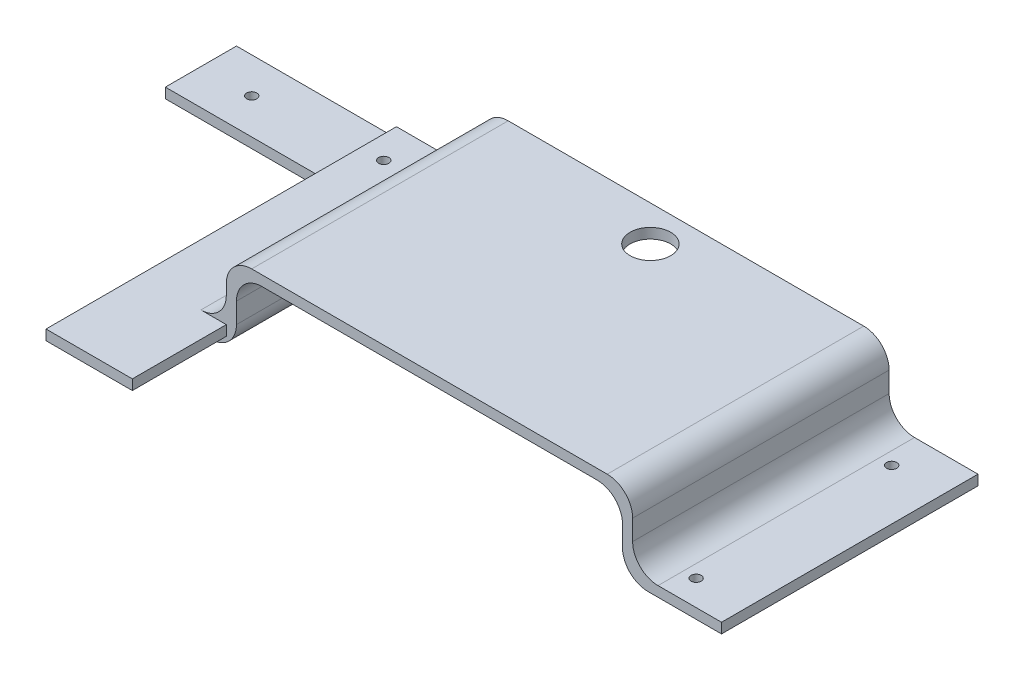
ISO-10303-21;
HEADER;
FILE_DESCRIPTION(('STEP AP214'),'2;1');
FILE_NAME('part.step','',(''),(''),'','','');
FILE_SCHEMA(('AUTOMOTIVE_DESIGN { 1 0 10303 214 1 1 1 1 }'));
ENDSEC;
DATA;
#1=APPLICATION_CONTEXT('core data for automotive mechanical design processes');
#2=APPLICATION_PROTOCOL_DEFINITION('international standard','automotive_design',2000,#1);
#3=PRODUCT_CONTEXT('',#1,'mechanical');
#4=PRODUCT('Part','Part','',(#3));
#5=PRODUCT_RELATED_PRODUCT_CATEGORY('part','',(#4));
#6=PRODUCT_DEFINITION_FORMATION('','',#4);
#7=PRODUCT_DEFINITION_CONTEXT('part definition',#1,'design');
#8=PRODUCT_DEFINITION('design','',#6,#7);
#9=PRODUCT_DEFINITION_SHAPE('','',#8);
#10=(LENGTH_UNIT() NAMED_UNIT(*) SI_UNIT(.MILLI.,.METRE.));
#11=(NAMED_UNIT(*) PLANE_ANGLE_UNIT() SI_UNIT($,.RADIAN.));
#12=(NAMED_UNIT(*) SI_UNIT($,.STERADIAN.) SOLID_ANGLE_UNIT());
#13=UNCERTAINTY_MEASURE_WITH_UNIT(LENGTH_MEASURE(1.E-05),#10,'distance_accuracy_value','');
#14=(GEOMETRIC_REPRESENTATION_CONTEXT(3) GLOBAL_UNCERTAINTY_ASSIGNED_CONTEXT((#13)) GLOBAL_UNIT_ASSIGNED_CONTEXT((#10,
#11,#12)) REPRESENTATION_CONTEXT('',''));
#15=CARTESIAN_POINT('',(0.,0.,0.));
#16=DIRECTION('',(0.,0.,1.));
#17=DIRECTION('',(1.,0.,0.));
#18=AXIS2_PLACEMENT_3D('',#15,#16,#17);
#19=CARTESIAN_POINT('',(0.,22.,-87.));
#20=DIRECTION('',(0.,1.,0.));
#21=DIRECTION('',(0.,0.,-1.));
#22=AXIS2_PLACEMENT_3D('',#19,#20,#21);
#23=PLANE('',#22);
#24=CARTESIAN_POINT('',(10.,22.,-87.));
#25=DIRECTION('',(0.,-1.,0.));
#26=DIRECTION('',(0.,0.,-1.));
#27=AXIS2_PLACEMENT_3D('',#24,#25,#26);
#28=CIRCLE('',#27,4.);
#29=CARTESIAN_POINT('',(10.,22.,-91.));
#30=VERTEX_POINT('',#29);
#31=EDGE_CURVE('E249',#30,#30,#28,.T.);
#32=ORIENTED_EDGE('',*,*,#31,.F.);
#33=EDGE_LOOP('',(#32));
#34=FACE_BOUND('',#33,.T.);
#35=DIRECTION('',(1.,0.,0.));
#36=VECTOR('',#35,1.);
#37=CARTESIAN_POINT('',(0.,22.,-43.5));
#38=LINE('',#37,#36);
#39=CARTESIAN_POINT('',(-23.,22.,-43.5));
#40=VERTEX_POINT('',#39);
#41=CARTESIAN_POINT('',(43.,22.,-43.5));
#42=VERTEX_POINT('',#41);
#43=EDGE_CURVE('E377',#40,#42,#38,.T.);
#44=ORIENTED_EDGE('',*,*,#43,.F.);
#45=DIRECTION('',(0.,0.,-1.));
#46=VECTOR('',#45,1.);
#47=CARTESIAN_POINT('',(-23.,22.,-87.));
#48=LINE('',#47,#46);
#49=CARTESIAN_POINT('',(-23.,22.,-94.));
#50=VERTEX_POINT('',#49);
#51=EDGE_CURVE('E320',#50,#40,#48,.F.);
#52=ORIENTED_EDGE('',*,*,#51,.F.);
#53=DIRECTION('',(1.,0.,0.));
#54=VECTOR('',#53,1.);
#55=CARTESIAN_POINT('',(0.,22.,-94.));
#56=LINE('',#55,#54);
#57=CARTESIAN_POINT('',(43.,22.,-94.));
#58=VERTEX_POINT('',#57);
#59=EDGE_CURVE('E266',#50,#58,#56,.T.);
#60=ORIENTED_EDGE('',*,*,#59,.T.);
#61=DIRECTION('',(0.,0.,-1.));
#62=VECTOR('',#61,1.);
#63=CARTESIAN_POINT('',(43.,22.,-87.));
#64=LINE('',#63,#62);
#65=EDGE_CURVE('E323',#42,#58,#64,.T.);
#66=ORIENTED_EDGE('',*,*,#65,.F.);
#67=EDGE_LOOP('',(#44,#52,#60,#66));
#68=FACE_BOUND('',#67,.T.);
#69=ADVANCED_FACE('F45',(#34,#68),#23,.F.);
#70=CARTESIAN_POINT('',(0.,9.99999999999999,-29.8776496959689));
#71=DIRECTION('',(0.,1.,0.));
#72=DIRECTION('',(-1.,0.,0.));
#73=AXIS2_PLACEMENT_3D('',#70,#71,#72);
#74=PLANE('',#73);
#75=CARTESIAN_POINT('',(-68.5,9.99999999999999,-87.));
#76=DIRECTION('',(0.,-1.,0.));
#77=DIRECTION('',(-1.,0.,0.));
#78=AXIS2_PLACEMENT_3D('',#75,#76,#77);
#79=CIRCLE('',#78,0.999999999999998);
#80=CARTESIAN_POINT('',(-69.5,9.99999999999999,-87.));
#81=VERTEX_POINT('',#80);
#82=EDGE_CURVE('E430',#81,#81,#79,.F.);
#83=ORIENTED_EDGE('',*,*,#82,.F.);
#84=EDGE_LOOP('',(#83));
#85=FACE_BOUND('',#84,.T.);
#86=DIRECTION('',(-1.,0.,0.));
#87=VECTOR('',#86,1.);
#88=CARTESIAN_POINT('',(0.,9.99999999999999,-94.));
#89=LINE('',#88,#87);
#90=CARTESIAN_POINT('',(-47.,9.99999999999999,-94.));
#91=VERTEX_POINT('',#90);
#92=CARTESIAN_POINT('',(-78.5,9.99999999999999,-94.));
#93=VERTEX_POINT('',#92);
#94=EDGE_CURVE('E270',#91,#93,#89,.T.);
#95=ORIENTED_EDGE('',*,*,#94,.T.);
#96=DIRECTION('',(0.,0.,1.));
#97=VECTOR('',#96,1.);
#98=CARTESIAN_POINT('',(-78.5,9.99999999999999,-94.));
#99=LINE('',#98,#97);
#100=CARTESIAN_POINT('',(-78.5,9.99999999999999,-80.));
#101=VERTEX_POINT('',#100);
#102=EDGE_CURVE('E466',#93,#101,#99,.T.);
#103=ORIENTED_EDGE('',*,*,#102,.T.);
#104=DIRECTION('',(1.,0.,0.));
#105=VECTOR('',#104,1.);
#106=CARTESIAN_POINT('',(0.,9.99999999999999,-80.));
#107=LINE('',#106,#105);
#108=CARTESIAN_POINT('',(-47.,9.99999999999999,-80.));
#109=VERTEX_POINT('',#108);
#110=EDGE_CURVE('E259',#101,#109,#107,.T.);
#111=ORIENTED_EDGE('',*,*,#110,.T.);
#112=DIRECTION('',(0.,0.,1.));
#113=VECTOR('',#112,1.);
#114=CARTESIAN_POINT('',(-47.,9.99999999999999,-111.117242768624));
#115=LINE('',#114,#113);
#116=EDGE_CURVE('E453',#91,#109,#115,.T.);
#117=ORIENTED_EDGE('',*,*,#116,.F.);
#118=EDGE_LOOP('',(#95,#103,#111,#117));
#119=FACE_BOUND('',#118,.T.);
#120=ADVANCED_FACE('F476',(#85,#119),#74,.T.);
#121=CARTESIAN_POINT('',(-30.,0.,-29.8776496959689));
#122=DIRECTION('',(-1.,0.,0.));
#123=DIRECTION('',(0.,0.,-1.));
#124=AXIS2_PLACEMENT_3D('',#121,#122,#123);
#125=PLANE('',#124);
#126=DIRECTION('',(0.,-1.,0.));
#127=VECTOR('',#126,1.);
#128=CARTESIAN_POINT('',(-30.,0.,-94.));
#129=LINE('',#128,#127);
#130=CARTESIAN_POINT('',(-30.,19.,-94.));
#131=VERTEX_POINT('',#130);
#132=CARTESIAN_POINT('',(-30.,17.,-94.));
#133=VERTEX_POINT('',#132);
#134=EDGE_CURVE('E267',#131,#133,#129,.T.);
#135=ORIENTED_EDGE('',*,*,#134,.T.);
#136=DIRECTION('',(0.,0.,1.));
#137=VECTOR('',#136,1.);
#138=CARTESIAN_POINT('',(-30.,17.,-29.8776496959689));
#139=LINE('',#138,#137);
#140=CARTESIAN_POINT('',(-30.,17.,-43.5));
#141=VERTEX_POINT('',#140);
#142=EDGE_CURVE('E303',#141,#133,#139,.F.);
#143=ORIENTED_EDGE('',*,*,#142,.F.);
#144=DIRECTION('',(0.,-1.,0.));
#145=VECTOR('',#144,1.);
#146=CARTESIAN_POINT('',(-30.,0.,-43.5));
#147=LINE('',#146,#145);
#148=CARTESIAN_POINT('',(-30.,19.,-43.5));
#149=VERTEX_POINT('',#148);
#150=EDGE_CURVE('E371',#149,#141,#147,.T.);
#151=ORIENTED_EDGE('',*,*,#150,.F.);
#152=DIRECTION('',(0.,0.,-1.));
#153=VECTOR('',#152,1.);
#154=CARTESIAN_POINT('',(-30.,19.,-29.8776496959689));
#155=LINE('',#154,#153);
#156=EDGE_CURVE('E306',#131,#149,#155,.F.);
#157=ORIENTED_EDGE('',*,*,#156,.F.);
#158=EDGE_LOOP('',(#135,#143,#151,#157));
#159=FACE_BOUND('',#158,.T.);
#160=ADVANCED_FACE('F531',(#159),#125,.T.);
#161=CARTESIAN_POINT('',(0.,24.,-87.));
#162=DIRECTION('',(0.,1.,0.));
#163=DIRECTION('',(0.,0.,-1.));
#164=AXIS2_PLACEMENT_3D('',#161,#162,#163);
#165=PLANE('',#164);
#166=CARTESIAN_POINT('',(10.,24.,-87.));
#167=DIRECTION('',(0.,-1.,0.));
#168=DIRECTION('',(0.,0.,-1.));
#169=AXIS2_PLACEMENT_3D('',#166,#167,#168);
#170=CIRCLE('',#169,4.);
#171=CARTESIAN_POINT('',(10.,24.,-91.));
#172=VERTEX_POINT('',#171);
#173=EDGE_CURVE('E243',#172,#172,#170,.F.);
#174=ORIENTED_EDGE('',*,*,#173,.F.);
#175=EDGE_LOOP('',(#174));
#176=FACE_BOUND('',#175,.T.);
#177=DIRECTION('',(1.,0.,0.));
#178=VECTOR('',#177,1.);
#179=CARTESIAN_POINT('',(0.,24.,-43.5));
#180=LINE('',#179,#178);
#181=CARTESIAN_POINT('',(-25.,24.,-43.5));
#182=VERTEX_POINT('',#181);
#183=CARTESIAN_POINT('',(45.,24.,-43.5));
#184=VERTEX_POINT('',#183);
#185=EDGE_CURVE('E368',#182,#184,#180,.T.);
#186=ORIENTED_EDGE('',*,*,#185,.T.);
#187=DIRECTION('',(0.,0.,-1.));
#188=VECTOR('',#187,1.);
#189=CARTESIAN_POINT('',(45.,24.,-87.));
#190=LINE('',#189,#188);
#191=CARTESIAN_POINT('',(45.,24.,-94.));
#192=VERTEX_POINT('',#191);
#193=EDGE_CURVE('E280',#192,#184,#190,.F.);
#194=ORIENTED_EDGE('',*,*,#193,.F.);
#195=DIRECTION('',(1.,0.,0.));
#196=VECTOR('',#195,1.);
#197=CARTESIAN_POINT('',(0.,24.,-94.));
#198=LINE('',#197,#196);
#199=CARTESIAN_POINT('',(-25.,24.,-94.));
#200=VERTEX_POINT('',#199);
#201=EDGE_CURVE('E278',#200,#192,#198,.T.);
#202=ORIENTED_EDGE('',*,*,#201,.F.);
#203=DIRECTION('',(0.,0.,-1.));
#204=VECTOR('',#203,1.);
#205=CARTESIAN_POINT('',(-25.,24.,-87.));
#206=LINE('',#205,#204);
#207=EDGE_CURVE('E290',#182,#200,#206,.T.);
#208=ORIENTED_EDGE('',*,*,#207,.F.);
#209=EDGE_LOOP('',(#186,#194,#202,#208));
#210=FACE_BOUND('',#209,.T.);
#211=ADVANCED_FACE('F524',(#176,#210),#165,.T.);
#212=CARTESIAN_POINT('',(0.,24.,-94.));
#213=DIRECTION('',(0.,0.,1.));
#214=DIRECTION('',(-1.,0.,0.));
#215=AXIS2_PLACEMENT_3D('',#212,#213,#214);
#216=PLANE('',#215);
#217=ORIENTED_EDGE('',*,*,#201,.T.);
#218=CARTESIAN_POINT('',(45.,19.,-94.));
#219=DIRECTION('',(0.,0.,-1.));
#220=DIRECTION('',(-1.,0.,0.));
#221=AXIS2_PLACEMENT_3D('',#218,#219,#220);
#222=CIRCLE('',#221,5.);
#223=CARTESIAN_POINT('',(50.,19.,-94.));
#224=VERTEX_POINT('',#223);
#225=EDGE_CURVE('E299',#224,#192,#222,.F.);
#226=ORIENTED_EDGE('',*,*,#225,.F.);
#227=DIRECTION('',(0.,1.,0.));
#228=VECTOR('',#227,1.);
#229=CARTESIAN_POINT('',(50.,0.,-94.));
#230=LINE('',#229,#228);
#231=CARTESIAN_POINT('',(50.,15.,-94.));
#232=VERTEX_POINT('',#231);
#233=EDGE_CURVE('E242',#232,#224,#230,.T.);
#234=ORIENTED_EDGE('',*,*,#233,.F.);
#235=CARTESIAN_POINT('',(55.,15.,-94.));
#236=DIRECTION('',(0.,0.,-1.));
#237=DIRECTION('',(-1.,0.,0.));
#238=AXIS2_PLACEMENT_3D('',#235,#236,#237);
#239=CIRCLE('',#238,5.);
#240=CARTESIAN_POINT('',(55.,10.,-94.));
#241=VERTEX_POINT('',#240);
#242=EDGE_CURVE('E53',#241,#232,#239,.T.);
#243=ORIENTED_EDGE('',*,*,#242,.F.);
#244=DIRECTION('',(-1.,0.,0.));
#245=VECTOR('',#244,1.);
#246=CARTESIAN_POINT('',(0.,9.99999999999999,-94.));
#247=LINE('',#246,#245);
#248=CARTESIAN_POINT('',(67.5,10.,-94.));
#249=VERTEX_POINT('',#248);
#250=EDGE_CURVE('E223',#249,#241,#247,.T.);
#251=ORIENTED_EDGE('',*,*,#250,.F.);
#252=DIRECTION('',(0.,-1.,0.));
#253=VECTOR('',#252,1.);
#254=CARTESIAN_POINT('',(67.5,10.,-94.));
#255=LINE('',#254,#253);
#256=CARTESIAN_POINT('',(67.5,8.,-94.));
#257=VERTEX_POINT('',#256);
#258=EDGE_CURVE('E228',#249,#257,#255,.T.);
#259=ORIENTED_EDGE('',*,*,#258,.T.);
#260=DIRECTION('',(1.,0.,0.));
#261=VECTOR('',#260,1.);
#262=CARTESIAN_POINT('',(0.,8.,-94.));
#263=LINE('',#262,#261);
#264=CARTESIAN_POINT('',(53.,8.,-94.));
#265=VERTEX_POINT('',#264);
#266=EDGE_CURVE('E257',#265,#257,#263,.T.);
#267=ORIENTED_EDGE('',*,*,#266,.F.);
#268=CARTESIAN_POINT('',(53.,13.,-94.));
#269=DIRECTION('',(0.,0.,-1.));
#270=DIRECTION('',(-1.,0.,0.));
#271=AXIS2_PLACEMENT_3D('',#268,#269,#270);
#272=CIRCLE('',#271,5.);
#273=CARTESIAN_POINT('',(48.,13.,-94.));
#274=VERTEX_POINT('',#273);
#275=EDGE_CURVE('E293',#274,#265,#272,.F.);
#276=ORIENTED_EDGE('',*,*,#275,.F.);
#277=DIRECTION('',(0.,-1.,0.));
#278=VECTOR('',#277,1.);
#279=CARTESIAN_POINT('',(48.,0.,-94.));
#280=LINE('',#279,#278);
#281=CARTESIAN_POINT('',(48.,17.,-94.));
#282=VERTEX_POINT('',#281);
#283=EDGE_CURVE('E246',#282,#274,#280,.T.);
#284=ORIENTED_EDGE('',*,*,#283,.F.);
#285=CARTESIAN_POINT('',(43.,17.,-94.));
#286=DIRECTION('',(0.,0.,-1.));
#287=DIRECTION('',(-1.,0.,0.));
#288=AXIS2_PLACEMENT_3D('',#285,#286,#287);
#289=CIRCLE('',#288,5.);
#290=EDGE_CURVE('E351',#58,#282,#289,.T.);
#291=ORIENTED_EDGE('',*,*,#290,.F.);
#292=ORIENTED_EDGE('',*,*,#59,.F.);
#293=CARTESIAN_POINT('',(-23.,17.,-94.));
#294=DIRECTION('',(0.,0.,-1.));
#295=DIRECTION('',(-1.,0.,0.));
#296=AXIS2_PLACEMENT_3D('',#293,#294,#295);
#297=CIRCLE('',#296,5.);
#298=CARTESIAN_POINT('',(-28.,17.,-94.));
#299=VERTEX_POINT('',#298);
#300=EDGE_CURVE('E356',#299,#50,#297,.T.);
#301=ORIENTED_EDGE('',*,*,#300,.F.);
#302=DIRECTION('',(0.,1.,0.));
#303=VECTOR('',#302,1.);
#304=CARTESIAN_POINT('',(-28.,0.,-94.));
#305=LINE('',#304,#303);
#306=CARTESIAN_POINT('',(-28.,13.,-94.));
#307=VERTEX_POINT('',#306);
#308=EDGE_CURVE('E263',#307,#299,#305,.T.);
#309=ORIENTED_EDGE('',*,*,#308,.F.);
#310=CARTESIAN_POINT('',(-33.,13.,-94.));
#311=DIRECTION('',(0.,0.,-1.));
#312=DIRECTION('',(-1.,0.,0.));
#313=AXIS2_PLACEMENT_3D('',#310,#311,#312);
#314=CIRCLE('',#313,5.);
#315=CARTESIAN_POINT('',(-33.,8.,-94.));
#316=VERTEX_POINT('',#315);
#317=EDGE_CURVE('E296',#316,#307,#314,.F.);
#318=ORIENTED_EDGE('',*,*,#317,.F.);
#319=DIRECTION('',(1.,0.,0.));
#320=VECTOR('',#319,1.);
#321=CARTESIAN_POINT('',(0.,8.,-94.));
#322=LINE('',#321,#320);
#323=CARTESIAN_POINT('',(-78.5,8.,-94.));
#324=VERTEX_POINT('',#323);
#325=EDGE_CURVE('E273',#324,#316,#322,.T.);
#326=ORIENTED_EDGE('',*,*,#325,.F.);
#327=DIRECTION('',(0.,1.,0.));
#328=VECTOR('',#327,1.);
#329=CARTESIAN_POINT('',(-78.5,8.,-94.));
#330=LINE('',#329,#328);
#331=EDGE_CURVE('E464',#324,#93,#330,.T.);
#332=ORIENTED_EDGE('',*,*,#331,.T.);
#333=ORIENTED_EDGE('',*,*,#94,.F.);
#334=DIRECTION('',(0.,1.,0.));
#335=VECTOR('',#334,1.);
#336=CARTESIAN_POINT('',(-47.,0.,-94.));
#337=LINE('',#336,#335);
#338=CARTESIAN_POINT('',(-47.,12.,-94.));
#339=VERTEX_POINT('',#338);
#340=EDGE_CURVE('E448',#91,#339,#337,.T.);
#341=ORIENTED_EDGE('',*,*,#340,.T.);
#342=DIRECTION('',(1.,0.,0.));
#343=VECTOR('',#342,1.);
#344=CARTESIAN_POINT('',(0.,12.,-94.));
#345=LINE('',#344,#343);
#346=CARTESIAN_POINT('',(-35.,12.,-94.));
#347=VERTEX_POINT('',#346);
#348=EDGE_CURVE('E452',#339,#347,#345,.T.);
#349=ORIENTED_EDGE('',*,*,#348,.T.);
#350=CARTESIAN_POINT('',(-35.,17.,-94.));
#351=DIRECTION('',(0.,0.,-1.));
#352=DIRECTION('',(-1.,0.,0.));
#353=AXIS2_PLACEMENT_3D('',#350,#351,#352);
#354=CIRCLE('',#353,5.);
#355=EDGE_CURVE('E349',#133,#347,#354,.T.);
#356=ORIENTED_EDGE('',*,*,#355,.F.);
#357=ORIENTED_EDGE('',*,*,#134,.F.);
#358=CARTESIAN_POINT('',(-25.,19.,-94.));
#359=DIRECTION('',(0.,0.,-1.));
#360=DIRECTION('',(-1.,0.,0.));
#361=AXIS2_PLACEMENT_3D('',#358,#359,#360);
#362=CIRCLE('',#361,5.);
#363=EDGE_CURVE('E301',#200,#131,#362,.F.);
#364=ORIENTED_EDGE('',*,*,#363,.F.);
#365=EDGE_LOOP('',(#217,#226,#234,#243,#251,#259,#267,#276,#284,#291,#292,#301,#309,#318,#326,
#332,#333,#341,#349,#356,#357,#364));
#366=FACE_BOUND('',#365,.T.);
#367=ADVANCED_FACE('F239',(#366),#216,.F.);
#368=CARTESIAN_POINT('',(0.,24.,-80.));
#369=DIRECTION('',(0.,0.,-1.));
#370=DIRECTION('',(1.,0.,0.));
#371=AXIS2_PLACEMENT_3D('',#368,#369,#370);
#372=PLANE('',#371);
#373=ORIENTED_EDGE('',*,*,#110,.F.);
#374=DIRECTION('',(0.,-1.,0.));
#375=VECTOR('',#374,1.);
#376=CARTESIAN_POINT('',(-78.5,9.99999999999999,-80.));
#377=LINE('',#376,#375);
#378=CARTESIAN_POINT('',(-78.5,8.,-80.));
#379=VERTEX_POINT('',#378);
#380=EDGE_CURVE('E451',#101,#379,#377,.T.);
#381=ORIENTED_EDGE('',*,*,#380,.T.);
#382=DIRECTION('',(-1.,0.,0.));
#383=VECTOR('',#382,1.);
#384=CARTESIAN_POINT('',(0.,8.,-80.));
#385=LINE('',#384,#383);
#386=CARTESIAN_POINT('',(-47.,8.,-80.));
#387=VERTEX_POINT('',#386);
#388=EDGE_CURVE('E262',#387,#379,#385,.T.);
#389=ORIENTED_EDGE('',*,*,#388,.F.);
#390=DIRECTION('',(0.,-1.,0.));
#391=VECTOR('',#390,1.);
#392=CARTESIAN_POINT('',(-47.,0.,-80.));
#393=LINE('',#392,#391);
#394=EDGE_CURVE('E433',#109,#387,#393,.T.);
#395=ORIENTED_EDGE('',*,*,#394,.F.);
#396=EDGE_LOOP('',(#373,#381,#389,#395));
#397=FACE_BOUND('',#396,.T.);
#398=ADVANCED_FACE('F523',(#397),#372,.F.);
#399=CARTESIAN_POINT('',(-28.,0.,-29.8776496959689));
#400=DIRECTION('',(1.,0.,0.));
#401=DIRECTION('',(0.,1.,0.));
#402=AXIS2_PLACEMENT_3D('',#399,#400,#401);
#403=PLANE('',#402);
#404=DIRECTION('',(0.,1.,0.));
#405=VECTOR('',#404,1.);
#406=CARTESIAN_POINT('',(-28.,0.,-43.5));
#407=LINE('',#406,#405);
#408=CARTESIAN_POINT('',(-28.,13.,-43.5));
#409=VERTEX_POINT('',#408);
#410=CARTESIAN_POINT('',(-28.,17.,-43.5));
#411=VERTEX_POINT('',#410);
#412=EDGE_CURVE('E441',#409,#411,#407,.T.);
#413=ORIENTED_EDGE('',*,*,#412,.F.);
#414=DIRECTION('',(0.,0.,-1.));
#415=VECTOR('',#414,1.);
#416=CARTESIAN_POINT('',(-28.,13.,-29.8776496959689));
#417=LINE('',#416,#415);
#418=EDGE_CURVE('E331',#307,#409,#417,.F.);
#419=ORIENTED_EDGE('',*,*,#418,.F.);
#420=ORIENTED_EDGE('',*,*,#308,.T.);
#421=DIRECTION('',(0.,0.,-1.));
#422=VECTOR('',#421,1.);
#423=CARTESIAN_POINT('',(-28.,17.,-29.8776496959689));
#424=LINE('',#423,#422);
#425=EDGE_CURVE('E333',#411,#299,#424,.T.);
#426=ORIENTED_EDGE('',*,*,#425,.F.);
#427=EDGE_LOOP('',(#413,#419,#420,#426));
#428=FACE_BOUND('',#427,.T.);
#429=ADVANCED_FACE('F526',(#428),#403,.T.);
#430=CARTESIAN_POINT('',(0.,8.,-29.8776496959689));
#431=DIRECTION('',(0.,-1.,0.));
#432=DIRECTION('',(0.,0.,1.));
#433=AXIS2_PLACEMENT_3D('',#430,#431,#432);
#434=PLANE('',#433);
#435=CARTESIAN_POINT('',(-68.5,8.,-87.));
#436=DIRECTION('',(0.,-1.,0.));
#437=DIRECTION('',(0.,0.,-1.));
#438=AXIS2_PLACEMENT_3D('',#435,#436,#437);
#439=CIRCLE('',#438,0.999999999999998);
#440=CARTESIAN_POINT('',(-68.5,8.,-88.));
#441=VERTEX_POINT('',#440);
#442=EDGE_CURVE('E414',#441,#441,#439,.T.);
#443=ORIENTED_EDGE('',*,*,#442,.F.);
#444=EDGE_LOOP('',(#443));
#445=FACE_BOUND('',#444,.T.);
#446=CARTESIAN_POINT('',(-42.5,8.,-87.));
#447=DIRECTION('',(0.,-1.,0.));
#448=DIRECTION('',(0.,0.,-1.));
#449=AXIS2_PLACEMENT_3D('',#446,#447,#448);
#450=CIRCLE('',#449,0.999999999999998);
#451=CARTESIAN_POINT('',(-42.5,8.,-88.));
#452=VERTEX_POINT('',#451);
#453=EDGE_CURVE('E287',#452,#452,#450,.T.);
#454=ORIENTED_EDGE('',*,*,#453,.F.);
#455=EDGE_LOOP('',(#454));
#456=FACE_BOUND('',#455,.T.);
#457=DIRECTION('',(1.,0.,0.));
#458=VECTOR('',#457,1.);
#459=CARTESIAN_POINT('',(0.,8.,-43.5));
#460=LINE('',#459,#458);
#461=CARTESIAN_POINT('',(-47.,8.,-43.5));
#462=VERTEX_POINT('',#461);
#463=CARTESIAN_POINT('',(-33.,8.,-43.5));
#464=VERTEX_POINT('',#463);
#465=EDGE_CURVE('E437',#462,#464,#460,.T.);
#466=ORIENTED_EDGE('',*,*,#465,.F.);
#467=DIRECTION('',(0.,0.,-1.));
#468=VECTOR('',#467,1.);
#469=CARTESIAN_POINT('',(-47.,8.,-19.8991525575881));
#470=LINE('',#469,#468);
#471=EDGE_CURVE('E438',#462,#387,#470,.T.);
#472=ORIENTED_EDGE('',*,*,#471,.T.);
#473=ORIENTED_EDGE('',*,*,#388,.T.);
#474=DIRECTION('',(0.,0.,-1.));
#475=VECTOR('',#474,1.);
#476=CARTESIAN_POINT('',(-78.5,8.,-80.));
#477=LINE('',#476,#475);
#478=EDGE_CURVE('E462',#379,#324,#477,.T.);
#479=ORIENTED_EDGE('',*,*,#478,.T.);
#480=ORIENTED_EDGE('',*,*,#325,.T.);
#481=DIRECTION('',(0.,0.,-1.));
#482=VECTOR('',#481,1.);
#483=CARTESIAN_POINT('',(-33.,8.,-29.8776496959689));
#484=LINE('',#483,#482);
#485=EDGE_CURVE('E340',#464,#316,#484,.T.);
#486=ORIENTED_EDGE('',*,*,#485,.F.);
#487=EDGE_LOOP('',(#466,#472,#473,#479,#480,#486));
#488=FACE_BOUND('',#487,.T.);
#489=ADVANCED_FACE('F539',(#445,#456,#488),#434,.T.);
#490=CARTESIAN_POINT('',(0.,9.99999999999999,-43.5));
#491=DIRECTION('',(0.,1.,0.));
#492=DIRECTION('',(-1.,0.,0.));
#493=AXIS2_PLACEMENT_3D('',#490,#491,#492);
#494=PLANE('',#493);
#495=CARTESIAN_POINT('',(57.5,10.,-48.5));
#496=DIRECTION('',(0.,-1.,0.));
#497=DIRECTION('',(-1.,0.,0.));
#498=AXIS2_PLACEMENT_3D('',#495,#496,#497);
#499=CIRCLE('',#498,0.999999999999998);
#500=CARTESIAN_POINT('',(56.5,10.,-48.5));
#501=VERTEX_POINT('',#500);
#502=EDGE_CURVE('E427',#501,#501,#499,.F.);
#503=ORIENTED_EDGE('',*,*,#502,.F.);
#504=EDGE_LOOP('',(#503));
#505=FACE_BOUND('',#504,.T.);
#506=CARTESIAN_POINT('',(57.5,10.,-87.));
#507=DIRECTION('',(0.,-1.,0.));
#508=DIRECTION('',(-1.,0.,0.));
#509=AXIS2_PLACEMENT_3D('',#506,#507,#508);
#510=CIRCLE('',#509,0.999999999999998);
#511=CARTESIAN_POINT('',(56.5,10.,-87.));
#512=VERTEX_POINT('',#511);
#513=EDGE_CURVE('E286',#512,#512,#510,.F.);
#514=ORIENTED_EDGE('',*,*,#513,.F.);
#515=EDGE_LOOP('',(#514));
#516=FACE_BOUND('',#515,.T.);
#517=DIRECTION('',(-1.,0.,0.));
#518=VECTOR('',#517,1.);
#519=CARTESIAN_POINT('',(0.,9.99999999999999,-43.5));
#520=LINE('',#519,#518);
#521=CARTESIAN_POINT('',(67.5,10.,-43.5));
#522=VERTEX_POINT('',#521);
#523=CARTESIAN_POINT('',(55.,10.,-43.5));
#524=VERTEX_POINT('',#523);
#525=EDGE_CURVE('E226',#522,#524,#520,.T.);
#526=ORIENTED_EDGE('',*,*,#525,.F.);
#527=DIRECTION('',(0.,0.,-1.));
#528=VECTOR('',#527,1.);
#529=CARTESIAN_POINT('',(67.5,10.,-43.5));
#530=LINE('',#529,#528);
#531=EDGE_CURVE('E218',#522,#249,#530,.T.);
#532=ORIENTED_EDGE('',*,*,#531,.T.);
#533=ORIENTED_EDGE('',*,*,#250,.T.);
#534=DIRECTION('',(0.,0.,-1.));
#535=VECTOR('',#534,1.);
#536=CARTESIAN_POINT('',(55.,10.,-94.));
#537=LINE('',#536,#535);
#538=EDGE_CURVE('E345',#524,#241,#537,.T.);
#539=ORIENTED_EDGE('',*,*,#538,.F.);
#540=EDGE_LOOP('',(#526,#532,#533,#539));
#541=FACE_BOUND('',#540,.T.);
#542=ADVANCED_FACE('F220',(#505,#516,#541),#494,.T.);
#543=CARTESIAN_POINT('',(0.,8.,-43.5));
#544=DIRECTION('',(0.,-1.,0.));
#545=DIRECTION('',(0.,0.,1.));
#546=AXIS2_PLACEMENT_3D('',#543,#544,#545);
#547=PLANE('',#546);
#548=CARTESIAN_POINT('',(57.5,8.,-48.5));
#549=DIRECTION('',(0.,-1.,0.));
#550=DIRECTION('',(0.,0.,-1.));
#551=AXIS2_PLACEMENT_3D('',#548,#549,#550);
#552=CIRCLE('',#551,0.999999999999998);
#553=CARTESIAN_POINT('',(57.5,8.,-49.5));
#554=VERTEX_POINT('',#553);
#555=EDGE_CURVE('E418',#554,#554,#552,.T.);
#556=ORIENTED_EDGE('',*,*,#555,.F.);
#557=EDGE_LOOP('',(#556));
#558=FACE_BOUND('',#557,.T.);
#559=CARTESIAN_POINT('',(57.5,8.,-87.));
#560=DIRECTION('',(0.,-1.,0.));
#561=DIRECTION('',(0.,0.,-1.));
#562=AXIS2_PLACEMENT_3D('',#559,#560,#561);
#563=CIRCLE('',#562,0.999999999999998);
#564=CARTESIAN_POINT('',(57.5,8.,-88.));
#565=VERTEX_POINT('',#564);
#566=EDGE_CURVE('E415',#565,#565,#563,.T.);
#567=ORIENTED_EDGE('',*,*,#566,.F.);
#568=EDGE_LOOP('',(#567));
#569=FACE_BOUND('',#568,.T.);
#570=ORIENTED_EDGE('',*,*,#266,.T.);
#571=DIRECTION('',(0.,0.,1.));
#572=VECTOR('',#571,1.);
#573=CARTESIAN_POINT('',(67.5,8.,-94.));
#574=LINE('',#573,#572);
#575=CARTESIAN_POINT('',(67.5,8.,-43.5));
#576=VERTEX_POINT('',#575);
#577=EDGE_CURVE('E233',#257,#576,#574,.T.);
#578=ORIENTED_EDGE('',*,*,#577,.T.);
#579=DIRECTION('',(1.,0.,0.));
#580=VECTOR('',#579,1.);
#581=CARTESIAN_POINT('',(0.,8.,-43.5));
#582=LINE('',#581,#580);
#583=CARTESIAN_POINT('',(53.,8.,-43.5));
#584=VERTEX_POINT('',#583);
#585=EDGE_CURVE('E252',#584,#576,#582,.T.);
#586=ORIENTED_EDGE('',*,*,#585,.F.);
#587=DIRECTION('',(0.,0.,-1.));
#588=VECTOR('',#587,1.);
#589=CARTESIAN_POINT('',(53.,8.,-43.5));
#590=LINE('',#589,#588);
#591=EDGE_CURVE('E342',#265,#584,#590,.F.);
#592=ORIENTED_EDGE('',*,*,#591,.F.);
#593=EDGE_LOOP('',(#570,#578,#586,#592));
#594=FACE_BOUND('',#593,.T.);
#595=ADVANCED_FACE('F388',(#558,#569,#594),#547,.T.);
#596=CARTESIAN_POINT('',(48.,0.,-43.5));
#597=DIRECTION('',(-1.,0.,0.));
#598=DIRECTION('',(0.,0.,-1.));
#599=AXIS2_PLACEMENT_3D('',#596,#597,#598);
#600=PLANE('',#599);
#601=ORIENTED_EDGE('',*,*,#283,.T.);
#602=DIRECTION('',(0.,0.,-1.));
#603=VECTOR('',#602,1.);
#604=CARTESIAN_POINT('',(48.,13.,-43.5));
#605=LINE('',#604,#603);
#606=CARTESIAN_POINT('',(48.,13.,-43.5));
#607=VERTEX_POINT('',#606);
#608=EDGE_CURVE('E326',#607,#274,#605,.T.);
#609=ORIENTED_EDGE('',*,*,#608,.F.);
#610=DIRECTION('',(0.,-1.,0.));
#611=VECTOR('',#610,1.);
#612=CARTESIAN_POINT('',(48.,0.,-43.5));
#613=LINE('',#612,#611);
#614=CARTESIAN_POINT('',(48.,17.,-43.5));
#615=VERTEX_POINT('',#614);
#616=EDGE_CURVE('E379',#615,#607,#613,.T.);
#617=ORIENTED_EDGE('',*,*,#616,.F.);
#618=DIRECTION('',(0.,0.,-1.));
#619=VECTOR('',#618,1.);
#620=CARTESIAN_POINT('',(48.,17.,-43.5));
#621=LINE('',#620,#619);
#622=EDGE_CURVE('E328',#282,#615,#621,.F.);
#623=ORIENTED_EDGE('',*,*,#622,.F.);
#624=EDGE_LOOP('',(#601,#609,#617,#623));
#625=FACE_BOUND('',#624,.T.);
#626=ADVANCED_FACE('F493',(#625),#600,.T.);
#627=CARTESIAN_POINT('',(50.,0.,-43.5));
#628=DIRECTION('',(1.,0.,0.));
#629=DIRECTION('',(0.,0.,1.));
#630=AXIS2_PLACEMENT_3D('',#627,#628,#629);
#631=PLANE('',#630);
#632=DIRECTION('',(0.,1.,0.));
#633=VECTOR('',#632,1.);
#634=CARTESIAN_POINT('',(50.,0.,-43.5));
#635=LINE('',#634,#633);
#636=CARTESIAN_POINT('',(50.,15.,-43.5));
#637=VERTEX_POINT('',#636);
#638=CARTESIAN_POINT('',(50.,19.,-43.5));
#639=VERTEX_POINT('',#638);
#640=EDGE_CURVE('E366',#637,#639,#635,.T.);
#641=ORIENTED_EDGE('',*,*,#640,.F.);
#642=DIRECTION('',(0.,0.,-1.));
#643=VECTOR('',#642,1.);
#644=CARTESIAN_POINT('',(50.,15.,-43.5));
#645=LINE('',#644,#643);
#646=EDGE_CURVE('E335',#232,#637,#645,.F.);
#647=ORIENTED_EDGE('',*,*,#646,.F.);
#648=ORIENTED_EDGE('',*,*,#233,.T.);
#649=DIRECTION('',(0.,0.,-1.));
#650=VECTOR('',#649,1.);
#651=CARTESIAN_POINT('',(50.,19.,-43.5));
#652=LINE('',#651,#650);
#653=EDGE_CURVE('E338',#639,#224,#652,.T.);
#654=ORIENTED_EDGE('',*,*,#653,.F.);
#655=EDGE_LOOP('',(#641,#647,#648,#654));
#656=FACE_BOUND('',#655,.T.);
#657=ADVANCED_FACE('F364',(#656),#631,.T.);
#658=CARTESIAN_POINT('',(0.,0.,-43.5));
#659=DIRECTION('',(0.,0.,-1.));
#660=DIRECTION('',(1.,0.,0.));
#661=AXIS2_PLACEMENT_3D('',#658,#659,#660);
#662=PLANE('',#661);
#663=ORIENTED_EDGE('',*,*,#150,.T.);
#664=CARTESIAN_POINT('',(-35.,17.,-43.5));
#665=DIRECTION('',(0.,0.,1.));
#666=DIRECTION('',(1.,0.,0.));
#667=AXIS2_PLACEMENT_3D('',#664,#665,#666);
#668=CIRCLE('',#667,5.);
#669=CARTESIAN_POINT('',(-35.,12.,-43.5));
#670=VERTEX_POINT('',#669);
#671=EDGE_CURVE('E347',#670,#141,#668,.T.);
#672=ORIENTED_EDGE('',*,*,#671,.F.);
#673=DIRECTION('',(1.,0.,0.));
#674=VECTOR('',#673,1.);
#675=CARTESIAN_POINT('',(0.,12.,-43.5));
#676=LINE('',#675,#674);
#677=CARTESIAN_POINT('',(-30.,12.,-43.5));
#678=VERTEX_POINT('',#677);
#679=EDGE_CURVE('E316',#670,#678,#676,.T.);
#680=ORIENTED_EDGE('',*,*,#679,.T.);
#681=DIRECTION('',(0.,1.,0.));
#682=VECTOR('',#681,1.);
#683=CARTESIAN_POINT('',(-30.,0.,-43.5));
#684=LINE('',#683,#682);
#685=CARTESIAN_POINT('',(-30.,9.99999999999999,-43.5));
#686=VERTEX_POINT('',#685);
#687=EDGE_CURVE('E411',#686,#678,#684,.T.);
#688=ORIENTED_EDGE('',*,*,#687,.F.);
#689=DIRECTION('',(1.,0.,0.));
#690=VECTOR('',#689,1.);
#691=CARTESIAN_POINT('',(0.,9.99999999999999,-43.5));
#692=LINE('',#691,#690);
#693=CARTESIAN_POINT('',(-47.,9.99999999999999,-43.5));
#694=VERTEX_POINT('',#693);
#695=EDGE_CURVE('E408',#694,#686,#692,.T.);
#696=ORIENTED_EDGE('',*,*,#695,.F.);
#697=DIRECTION('',(0.,1.,0.));
#698=VECTOR('',#697,1.);
#699=CARTESIAN_POINT('',(-47.,0.,-43.5));
#700=LINE('',#699,#698);
#701=EDGE_CURVE('E434',#462,#694,#700,.T.);
#702=ORIENTED_EDGE('',*,*,#701,.F.);
#703=ORIENTED_EDGE('',*,*,#465,.T.);
#704=CARTESIAN_POINT('',(-33.,13.,-43.5));
#705=DIRECTION('',(0.,0.,1.));
#706=DIRECTION('',(1.,0.,0.));
#707=AXIS2_PLACEMENT_3D('',#704,#705,#706);
#708=CIRCLE('',#707,5.);
#709=EDGE_CURVE('E68',#409,#464,#708,.F.);
#710=ORIENTED_EDGE('',*,*,#709,.F.);
#711=ORIENTED_EDGE('',*,*,#412,.T.);
#712=CARTESIAN_POINT('',(-23.,17.,-43.5));
#713=DIRECTION('',(0.,0.,1.));
#714=DIRECTION('',(1.,0.,0.));
#715=AXIS2_PLACEMENT_3D('',#712,#713,#714);
#716=CIRCLE('',#715,5.);
#717=EDGE_CURVE('E358',#40,#411,#716,.T.);
#718=ORIENTED_EDGE('',*,*,#717,.F.);
#719=ORIENTED_EDGE('',*,*,#43,.T.);
#720=CARTESIAN_POINT('',(43.,17.,-43.5));
#721=DIRECTION('',(0.,0.,1.));
#722=DIRECTION('',(1.,0.,0.));
#723=AXIS2_PLACEMENT_3D('',#720,#721,#722);
#724=CIRCLE('',#723,5.);
#725=EDGE_CURVE('E354',#615,#42,#724,.T.);
#726=ORIENTED_EDGE('',*,*,#725,.F.);
#727=ORIENTED_EDGE('',*,*,#616,.T.);
#728=CARTESIAN_POINT('',(53.,13.,-43.5));
#729=DIRECTION('',(0.,0.,1.));
#730=DIRECTION('',(1.,0.,0.));
#731=AXIS2_PLACEMENT_3D('',#728,#729,#730);
#732=CIRCLE('',#731,5.);
#733=EDGE_CURVE('E309',#584,#607,#732,.F.);
#734=ORIENTED_EDGE('',*,*,#733,.F.);
#735=ORIENTED_EDGE('',*,*,#585,.T.);
#736=DIRECTION('',(0.,1.,0.));
#737=VECTOR('',#736,1.);
#738=CARTESIAN_POINT('',(67.5,8.,-43.5));
#739=LINE('',#738,#737);
#740=EDGE_CURVE('E386',#576,#522,#739,.T.);
#741=ORIENTED_EDGE('',*,*,#740,.T.);
#742=ORIENTED_EDGE('',*,*,#525,.T.);
#743=CARTESIAN_POINT('',(55.,15.,-43.5));
#744=DIRECTION('',(0.,0.,1.));
#745=DIRECTION('',(1.,0.,0.));
#746=AXIS2_PLACEMENT_3D('',#743,#744,#745);
#747=CIRCLE('',#746,5.);
#748=EDGE_CURVE('E11',#637,#524,#747,.T.);
#749=ORIENTED_EDGE('',*,*,#748,.F.);
#750=ORIENTED_EDGE('',*,*,#640,.T.);
#751=CARTESIAN_POINT('',(45.,19.,-43.5));
#752=DIRECTION('',(0.,0.,1.));
#753=DIRECTION('',(1.,0.,0.));
#754=AXIS2_PLACEMENT_3D('',#751,#752,#753);
#755=CIRCLE('',#754,5.);
#756=EDGE_CURVE('E312',#184,#639,#755,.F.);
#757=ORIENTED_EDGE('',*,*,#756,.F.);
#758=ORIENTED_EDGE('',*,*,#185,.F.);
#759=CARTESIAN_POINT('',(-25.,19.,-43.5));
#760=DIRECTION('',(0.,0.,1.));
#761=DIRECTION('',(1.,0.,0.));
#762=AXIS2_PLACEMENT_3D('',#759,#760,#761);
#763=CIRCLE('',#762,5.);
#764=EDGE_CURVE('E314',#149,#182,#763,.F.);
#765=ORIENTED_EDGE('',*,*,#764,.F.);
#766=EDGE_LOOP('',(#663,#672,#680,#688,#696,#702,#703,#710,#711,#718,#719,#726,#727,#734,#735,
#741,#742,#749,#750,#757,#758,#765));
#767=FACE_BOUND('',#766,.T.);
#768=ADVANCED_FACE('F385',(#767),#662,.F.);
#769=CARTESIAN_POINT('',(10.,35.,-87.));
#770=DIRECTION('',(0.,-1.,0.));
#771=DIRECTION('',(0.,0.,1.));
#772=AXIS2_PLACEMENT_3D('',#769,#770,#771);
#773=CYLINDRICAL_SURFACE('',#772,4.);
#774=ORIENTED_EDGE('',*,*,#173,.T.);
#775=EDGE_LOOP('',(#774));
#776=FACE_BOUND('',#775,.T.);
#777=ORIENTED_EDGE('',*,*,#31,.T.);
#778=EDGE_LOOP('',(#777));
#779=FACE_BOUND('',#778,.T.);
#780=ADVANCED_FACE('F472',(#776,#779),#773,.F.);
#781=CARTESIAN_POINT('',(-78.5,0.,-87.));
#782=DIRECTION('',(-1.,0.,0.));
#783=DIRECTION('',(0.,0.,-1.));
#784=AXIS2_PLACEMENT_3D('',#781,#782,#783);
#785=PLANE('',#784);
#786=ORIENTED_EDGE('',*,*,#380,.F.);
#787=ORIENTED_EDGE('',*,*,#102,.F.);
#788=ORIENTED_EDGE('',*,*,#331,.F.);
#789=ORIENTED_EDGE('',*,*,#478,.F.);
#790=EDGE_LOOP('',(#786,#787,#788,#789));
#791=FACE_BOUND('',#790,.T.);
#792=ADVANCED_FACE('F560',(#791),#785,.T.);
#793=CARTESIAN_POINT('',(0.,12.,-111.117242768624));
#794=DIRECTION('',(0.,-1.,0.));
#795=DIRECTION('',(1.,0.,0.));
#796=AXIS2_PLACEMENT_3D('',#793,#794,#795);
#797=PLANE('',#796);
#798=ORIENTED_EDGE('',*,*,#348,.F.);
#799=DIRECTION('',(0.,0.,1.));
#800=VECTOR('',#799,1.);
#801=CARTESIAN_POINT('',(-47.,12.,-111.117242768624));
#802=LINE('',#801,#800);
#803=CARTESIAN_POINT('',(-47.,12.,-25.));
#804=VERTEX_POINT('',#803);
#805=EDGE_CURVE('E444',#339,#804,#802,.T.);
#806=ORIENTED_EDGE('',*,*,#805,.T.);
#807=DIRECTION('',(-1.,0.,0.));
#808=VECTOR('',#807,1.);
#809=CARTESIAN_POINT('',(0.,12.,-25.));
#810=LINE('',#809,#808);
#811=CARTESIAN_POINT('',(-30.,12.,-25.));
#812=VERTEX_POINT('',#811);
#813=EDGE_CURVE('E395',#812,#804,#810,.T.);
#814=ORIENTED_EDGE('',*,*,#813,.F.);
#815=DIRECTION('',(0.,0.,-1.));
#816=VECTOR('',#815,1.);
#817=CARTESIAN_POINT('',(-30.,12.,-25.));
#818=LINE('',#817,#816);
#819=EDGE_CURVE('E406',#812,#678,#818,.T.);
#820=ORIENTED_EDGE('',*,*,#819,.T.);
#821=ORIENTED_EDGE('',*,*,#679,.F.);
#822=DIRECTION('',(0.,0.,1.));
#823=VECTOR('',#822,1.);
#824=CARTESIAN_POINT('',(-35.,12.,-111.117242768624));
#825=LINE('',#824,#823);
#826=EDGE_CURVE('E60',#347,#670,#825,.T.);
#827=ORIENTED_EDGE('',*,*,#826,.F.);
#828=EDGE_LOOP('',(#798,#806,#814,#820,#821,#827));
#829=FACE_BOUND('',#828,.T.);
#830=CARTESIAN_POINT('',(-42.5,12.,-87.));
#831=DIRECTION('',(0.,1.,0.));
#832=DIRECTION('',(1.,0.,0.));
#833=AXIS2_PLACEMENT_3D('',#830,#831,#832);
#834=CIRCLE('',#833,0.999999999999998);
#835=CARTESIAN_POINT('',(-41.5,12.,-87.));
#836=VERTEX_POINT('',#835);
#837=EDGE_CURVE('E283',#836,#836,#834,.F.);
#838=ORIENTED_EDGE('',*,*,#837,.T.);
#839=EDGE_LOOP('',(#838));
#840=FACE_BOUND('',#839,.T.);
#841=ADVANCED_FACE('F564',(#829,#840),#797,.F.);
#842=CARTESIAN_POINT('',(-47.,0.,-111.117242768624));
#843=DIRECTION('',(1.,0.,0.));
#844=DIRECTION('',(0.,0.,1.));
#845=AXIS2_PLACEMENT_3D('',#842,#843,#844);
#846=PLANE('',#845);
#847=ORIENTED_EDGE('',*,*,#394,.T.);
#848=ORIENTED_EDGE('',*,*,#471,.F.);
#849=ORIENTED_EDGE('',*,*,#701,.T.);
#850=DIRECTION('',(0.,0.,-1.));
#851=VECTOR('',#850,1.);
#852=CARTESIAN_POINT('',(-47.,9.99999999999999,-25.));
#853=LINE('',#852,#851);
#854=CARTESIAN_POINT('',(-47.,9.99999999999999,-25.));
#855=VERTEX_POINT('',#854);
#856=EDGE_CURVE('E402',#855,#694,#853,.T.);
#857=ORIENTED_EDGE('',*,*,#856,.F.);
#858=DIRECTION('',(0.,-1.,0.));
#859=VECTOR('',#858,1.);
#860=CARTESIAN_POINT('',(-47.,0.,-25.));
#861=LINE('',#860,#859);
#862=EDGE_CURVE('E390',#804,#855,#861,.T.);
#863=ORIENTED_EDGE('',*,*,#862,.F.);
#864=ORIENTED_EDGE('',*,*,#805,.F.);
#865=ORIENTED_EDGE('',*,*,#340,.F.);
#866=ORIENTED_EDGE('',*,*,#116,.T.);
#867=EDGE_LOOP('',(#847,#848,#849,#857,#863,#864,#865,#866));
#868=FACE_BOUND('',#867,.T.);
#869=ADVANCED_FACE('F566',(#868),#846,.F.);
#870=CARTESIAN_POINT('',(-42.5,35.,-87.));
#871=DIRECTION('',(0.,-1.,0.));
#872=DIRECTION('',(0.,0.,1.));
#873=AXIS2_PLACEMENT_3D('',#870,#871,#872);
#874=CYLINDRICAL_SURFACE('',#873,0.999999999999998);
#875=ORIENTED_EDGE('',*,*,#453,.T.);
#876=EDGE_LOOP('',(#875));
#877=FACE_BOUND('',#876,.T.);
#878=ORIENTED_EDGE('',*,*,#837,.F.);
#879=EDGE_LOOP('',(#878));
#880=FACE_BOUND('',#879,.T.);
#881=ADVANCED_FACE('F569',(#877,#880),#874,.F.);
#882=CARTESIAN_POINT('',(57.5,35.,-87.));
#883=DIRECTION('',(0.,-1.,0.));
#884=DIRECTION('',(0.,0.,1.));
#885=AXIS2_PLACEMENT_3D('',#882,#883,#884);
#886=CYLINDRICAL_SURFACE('',#885,0.999999999999998);
#887=ORIENTED_EDGE('',*,*,#513,.T.);
#888=EDGE_LOOP('',(#887));
#889=FACE_BOUND('',#888,.T.);
#890=ORIENTED_EDGE('',*,*,#566,.T.);
#891=EDGE_LOOP('',(#890));
#892=FACE_BOUND('',#891,.T.);
#893=ADVANCED_FACE('F576',(#889,#892),#886,.F.);
#894=CARTESIAN_POINT('',(57.5,35.,-48.5));
#895=DIRECTION('',(0.,-1.,0.));
#896=DIRECTION('',(0.,0.,1.));
#897=AXIS2_PLACEMENT_3D('',#894,#895,#896);
#898=CYLINDRICAL_SURFACE('',#897,0.999999999999998);
#899=ORIENTED_EDGE('',*,*,#502,.T.);
#900=EDGE_LOOP('',(#899));
#901=FACE_BOUND('',#900,.T.);
#902=ORIENTED_EDGE('',*,*,#555,.T.);
#903=EDGE_LOOP('',(#902));
#904=FACE_BOUND('',#903,.T.);
#905=ADVANCED_FACE('F582',(#901,#904),#898,.F.);
#906=CARTESIAN_POINT('',(-68.5,35.,-87.));
#907=DIRECTION('',(0.,-1.,0.));
#908=DIRECTION('',(0.,0.,1.));
#909=AXIS2_PLACEMENT_3D('',#906,#907,#908);
#910=CYLINDRICAL_SURFACE('',#909,0.999999999999998);
#911=ORIENTED_EDGE('',*,*,#82,.T.);
#912=EDGE_LOOP('',(#911));
#913=FACE_BOUND('',#912,.T.);
#914=ORIENTED_EDGE('',*,*,#442,.T.);
#915=EDGE_LOOP('',(#914));
#916=FACE_BOUND('',#915,.T.);
#917=ADVANCED_FACE('F578',(#913,#916),#910,.F.);
#918=CARTESIAN_POINT('',(-30.,0.,-25.));
#919=DIRECTION('',(1.,0.,0.));
#920=DIRECTION('',(0.,0.,1.));
#921=AXIS2_PLACEMENT_3D('',#918,#919,#920);
#922=PLANE('',#921);
#923=ORIENTED_EDGE('',*,*,#687,.T.);
#924=ORIENTED_EDGE('',*,*,#819,.F.);
#925=DIRECTION('',(0.,1.,0.));
#926=VECTOR('',#925,1.);
#927=CARTESIAN_POINT('',(-30.,0.,-25.));
#928=LINE('',#927,#926);
#929=CARTESIAN_POINT('',(-30.,9.99999999999999,-25.));
#930=VERTEX_POINT('',#929);
#931=EDGE_CURVE('E398',#930,#812,#928,.T.);
#932=ORIENTED_EDGE('',*,*,#931,.F.);
#933=DIRECTION('',(0.,0.,-1.));
#934=VECTOR('',#933,1.);
#935=CARTESIAN_POINT('',(-30.,9.99999999999999,-25.));
#936=LINE('',#935,#934);
#937=EDGE_CURVE('E404',#930,#686,#936,.T.);
#938=ORIENTED_EDGE('',*,*,#937,.T.);
#939=EDGE_LOOP('',(#923,#924,#932,#938));
#940=FACE_BOUND('',#939,.T.);
#941=ADVANCED_FACE('F581',(#940),#922,.T.);
#942=CARTESIAN_POINT('',(0.,9.99999999999999,-25.));
#943=DIRECTION('',(0.,-1.,0.));
#944=DIRECTION('',(1.,0.,0.));
#945=AXIS2_PLACEMENT_3D('',#942,#943,#944);
#946=PLANE('',#945);
#947=ORIENTED_EDGE('',*,*,#695,.T.);
#948=ORIENTED_EDGE('',*,*,#937,.F.);
#949=DIRECTION('',(1.,0.,0.));
#950=VECTOR('',#949,1.);
#951=CARTESIAN_POINT('',(0.,9.99999999999999,-25.));
#952=LINE('',#951,#950);
#953=EDGE_CURVE('E400',#855,#930,#952,.T.);
#954=ORIENTED_EDGE('',*,*,#953,.F.);
#955=ORIENTED_EDGE('',*,*,#856,.T.);
#956=EDGE_LOOP('',(#947,#948,#954,#955));
#957=FACE_BOUND('',#956,.T.);
#958=ADVANCED_FACE('F592',(#957),#946,.T.);
#959=CARTESIAN_POINT('',(0.,0.,-25.));
#960=DIRECTION('',(0.,0.,1.));
#961=DIRECTION('',(-1.,0.,0.));
#962=AXIS2_PLACEMENT_3D('',#959,#960,#961);
#963=PLANE('',#962);
#964=ORIENTED_EDGE('',*,*,#862,.T.);
#965=ORIENTED_EDGE('',*,*,#953,.T.);
#966=ORIENTED_EDGE('',*,*,#931,.T.);
#967=ORIENTED_EDGE('',*,*,#813,.T.);
#968=EDGE_LOOP('',(#964,#965,#966,#967));
#969=FACE_BOUND('',#968,.T.);
#970=ADVANCED_FACE('F519',(#969),#963,.T.);
#971=CARTESIAN_POINT('',(-25.,19.,-87.));
#972=DIRECTION('',(0.,0.,-1.));
#973=DIRECTION('',(1.,0.,0.));
#974=AXIS2_PLACEMENT_3D('',#971,#972,#973);
#975=CYLINDRICAL_SURFACE('',#974,5.);
#976=ORIENTED_EDGE('',*,*,#764,.T.);
#977=ORIENTED_EDGE('',*,*,#207,.T.);
#978=ORIENTED_EDGE('',*,*,#363,.T.);
#979=ORIENTED_EDGE('',*,*,#156,.T.);
#980=EDGE_LOOP('',(#976,#977,#978,#979));
#981=FACE_BOUND('',#980,.T.);
#982=ADVANCED_FACE('F516',(#981),#975,.T.);
#983=CARTESIAN_POINT('',(-35.,17.,-111.117242768624));
#984=DIRECTION('',(0.,0.,1.));
#985=DIRECTION('',(0.,1.,0.));
#986=AXIS2_PLACEMENT_3D('',#983,#984,#985);
#987=CYLINDRICAL_SURFACE('',#986,5.);
#988=ORIENTED_EDGE('',*,*,#355,.T.);
#989=ORIENTED_EDGE('',*,*,#826,.T.);
#990=ORIENTED_EDGE('',*,*,#671,.T.);
#991=ORIENTED_EDGE('',*,*,#142,.T.);
#992=EDGE_LOOP('',(#988,#989,#990,#991));
#993=FACE_BOUND('',#992,.T.);
#994=ADVANCED_FACE('F513',(#993),#987,.F.);
#995=CARTESIAN_POINT('',(43.,17.,-87.));
#996=DIRECTION('',(0.,0.,-1.));
#997=DIRECTION('',(1.,0.,0.));
#998=AXIS2_PLACEMENT_3D('',#995,#996,#997);
#999=CYLINDRICAL_SURFACE('',#998,5.);
#1000=ORIENTED_EDGE('',*,*,#725,.T.);
#1001=ORIENTED_EDGE('',*,*,#65,.T.);
#1002=ORIENTED_EDGE('',*,*,#290,.T.);
#1003=ORIENTED_EDGE('',*,*,#622,.T.);
#1004=EDGE_LOOP('',(#1000,#1001,#1002,#1003));
#1005=FACE_BOUND('',#1004,.T.);
#1006=ADVANCED_FACE('F491',(#1005),#999,.F.);
#1007=CARTESIAN_POINT('',(-23.,17.,-29.8776496959689));
#1008=DIRECTION('',(0.,0.,-1.));
#1009=DIRECTION('',(1.,0.,0.));
#1010=AXIS2_PLACEMENT_3D('',#1007,#1008,#1009);
#1011=CYLINDRICAL_SURFACE('',#1010,5.);
#1012=ORIENTED_EDGE('',*,*,#717,.T.);
#1013=ORIENTED_EDGE('',*,*,#425,.T.);
#1014=ORIENTED_EDGE('',*,*,#300,.T.);
#1015=ORIENTED_EDGE('',*,*,#51,.T.);
#1016=EDGE_LOOP('',(#1012,#1013,#1014,#1015));
#1017=FACE_BOUND('',#1016,.T.);
#1018=ADVANCED_FACE('F484',(#1017),#1011,.F.);
#1019=CARTESIAN_POINT('',(45.,19.,-43.5));
#1020=DIRECTION('',(0.,0.,-1.));
#1021=DIRECTION('',(1.,0.,0.));
#1022=AXIS2_PLACEMENT_3D('',#1019,#1020,#1021);
#1023=CYLINDRICAL_SURFACE('',#1022,5.);
#1024=ORIENTED_EDGE('',*,*,#756,.T.);
#1025=ORIENTED_EDGE('',*,*,#653,.T.);
#1026=ORIENTED_EDGE('',*,*,#225,.T.);
#1027=ORIENTED_EDGE('',*,*,#193,.T.);
#1028=EDGE_LOOP('',(#1024,#1025,#1026,#1027));
#1029=FACE_BOUND('',#1028,.T.);
#1030=ADVANCED_FACE('F503',(#1029),#1023,.T.);
#1031=CARTESIAN_POINT('',(-33.,13.,-29.8776496959689));
#1032=DIRECTION('',(0.,0.,-1.));
#1033=DIRECTION('',(1.,0.,0.));
#1034=AXIS2_PLACEMENT_3D('',#1031,#1032,#1033);
#1035=CYLINDRICAL_SURFACE('',#1034,5.);
#1036=ORIENTED_EDGE('',*,*,#709,.T.);
#1037=ORIENTED_EDGE('',*,*,#485,.T.);
#1038=ORIENTED_EDGE('',*,*,#317,.T.);
#1039=ORIENTED_EDGE('',*,*,#418,.T.);
#1040=EDGE_LOOP('',(#1036,#1037,#1038,#1039));
#1041=FACE_BOUND('',#1040,.T.);
#1042=ADVANCED_FACE('F497',(#1041),#1035,.T.);
#1043=CARTESIAN_POINT('',(53.,13.,-43.5));
#1044=DIRECTION('',(0.,0.,-1.));
#1045=DIRECTION('',(1.,0.,0.));
#1046=AXIS2_PLACEMENT_3D('',#1043,#1044,#1045);
#1047=CYLINDRICAL_SURFACE('',#1046,5.);
#1048=ORIENTED_EDGE('',*,*,#733,.T.);
#1049=ORIENTED_EDGE('',*,*,#608,.T.);
#1050=ORIENTED_EDGE('',*,*,#275,.T.);
#1051=ORIENTED_EDGE('',*,*,#591,.T.);
#1052=EDGE_LOOP('',(#1048,#1049,#1050,#1051));
#1053=FACE_BOUND('',#1052,.T.);
#1054=ADVANCED_FACE('F495',(#1053),#1047,.T.);
#1055=CARTESIAN_POINT('',(55.,15.,-43.5));
#1056=DIRECTION('',(0.,0.,1.));
#1057=DIRECTION('',(-1.,0.,0.));
#1058=AXIS2_PLACEMENT_3D('',#1055,#1056,#1057);
#1059=CYLINDRICAL_SURFACE('',#1058,5.);
#1060=ORIENTED_EDGE('',*,*,#748,.T.);
#1061=ORIENTED_EDGE('',*,*,#538,.T.);
#1062=ORIENTED_EDGE('',*,*,#242,.T.);
#1063=ORIENTED_EDGE('',*,*,#646,.T.);
#1064=EDGE_LOOP('',(#1060,#1061,#1062,#1063));
#1065=FACE_BOUND('',#1064,.T.);
#1066=ADVANCED_FACE('F47',(#1065),#1059,.F.);
#1067=CARTESIAN_POINT('',(67.5,0.,-87.));
#1068=DIRECTION('',(1.,0.,0.));
#1069=DIRECTION('',(0.,0.,1.));
#1070=AXIS2_PLACEMENT_3D('',#1067,#1068,#1069);
#1071=PLANE('',#1070);
#1072=ORIENTED_EDGE('',*,*,#531,.F.);
#1073=ORIENTED_EDGE('',*,*,#740,.F.);
#1074=ORIENTED_EDGE('',*,*,#577,.F.);
#1075=ORIENTED_EDGE('',*,*,#258,.F.);
#1076=EDGE_LOOP('',(#1072,#1073,#1074,#1075));
#1077=FACE_BOUND('',#1076,.T.);
#1078=ADVANCED_FACE('F231',(#1077),#1071,.T.);
#1079=CLOSED_SHELL('',(#69,#120,#160,#211,#367,#398,#429,#489,#542,#595,#626,#657,#768,#780,
#792,#841,#869,#881,#893,#905,#917,#941,#958,#970,#982,#994,#1006,#1018,#1030,#1042,#1054,#1066,#1078));
#1080=MANIFOLD_SOLID_BREP('B2',#1079);
#1081=ADVANCED_BREP_SHAPE_REPRESENTATION('',(#18,#1080),#14);
#1082=SHAPE_DEFINITION_REPRESENTATION(#9,#1081);
ENDSEC;
END-ISO-10303-21;
